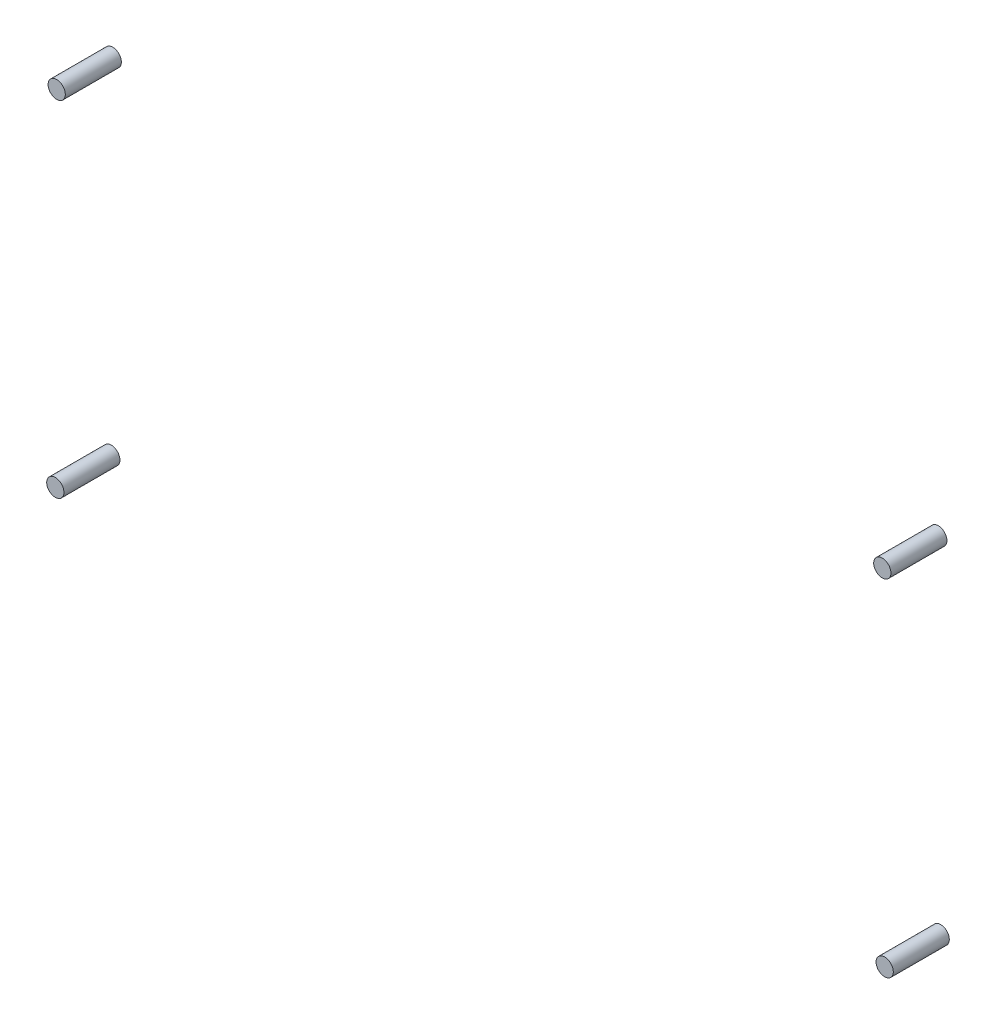
ISO-10303-21;
HEADER;
FILE_DESCRIPTION(('STEP AP214'),'2;1');
FILE_NAME('part.step','',(''),(''),'','','');
FILE_SCHEMA(('AUTOMOTIVE_DESIGN { 1 0 10303 214 1 1 1 1 }'));
ENDSEC;
DATA;
#1=APPLICATION_CONTEXT('core data for automotive mechanical design processes');
#2=APPLICATION_PROTOCOL_DEFINITION('international standard','automotive_design',2000,#1);
#3=PRODUCT_CONTEXT('',#1,'mechanical');
#4=PRODUCT('Part','Part','',(#3));
#5=PRODUCT_RELATED_PRODUCT_CATEGORY('part','',(#4));
#6=PRODUCT_DEFINITION_FORMATION('','',#4);
#7=PRODUCT_DEFINITION_CONTEXT('part definition',#1,'design');
#8=PRODUCT_DEFINITION('design','',#6,#7);
#9=PRODUCT_DEFINITION_SHAPE('','',#8);
#10=(LENGTH_UNIT() NAMED_UNIT(*) SI_UNIT(.MILLI.,.METRE.));
#11=(NAMED_UNIT(*) PLANE_ANGLE_UNIT() SI_UNIT($,.RADIAN.));
#12=(NAMED_UNIT(*) SI_UNIT($,.STERADIAN.) SOLID_ANGLE_UNIT());
#13=UNCERTAINTY_MEASURE_WITH_UNIT(LENGTH_MEASURE(1.E-05),#10,'distance_accuracy_value','');
#14=(GEOMETRIC_REPRESENTATION_CONTEXT(3) GLOBAL_UNCERTAINTY_ASSIGNED_CONTEXT((#13)) GLOBAL_UNIT_ASSIGNED_CONTEXT((#10,
#11,#12)) REPRESENTATION_CONTEXT('',''));
#15=CARTESIAN_POINT('',(0.,0.,0.));
#16=DIRECTION('',(0.,0.,1.));
#17=DIRECTION('',(1.,0.,0.));
#18=AXIS2_PLACEMENT_3D('',#15,#16,#17);
#19=CARTESIAN_POINT('',(46.693792227584,-228.9337388874,14.600050800102));
#20=DIRECTION('',(0.,0.,-1.));
#21=DIRECTION('',(-1.,0.,0.));
#22=AXIS2_PLACEMENT_3D('',#19,#20,#21);
#23=CYLINDRICAL_SURFACE('',#22,2.);
#24=CARTESIAN_POINT('',(46.693792227584,-228.9337388874,14.600050800102));
#25=DIRECTION('',(0.,0.,1.));
#26=DIRECTION('',(1.,0.,0.));
#27=AXIS2_PLACEMENT_3D('',#24,#25,#26);
#28=CIRCLE('',#27,2.);
#29=CARTESIAN_POINT('',(44.693792227584,-228.9337388874,14.600050800102));
#30=VERTEX_POINT('',#29);
#31=EDGE_CURVE('E11',#30,#30,#28,.T.);
#32=CARTESIAN_POINT('',(46.693792227584,-228.9337388874,1.600050800102));
#33=DIRECTION('',(0.,0.,1.));
#34=DIRECTION('',(1.,0.,0.));
#35=AXIS2_PLACEMENT_3D('',#32,#33,#34);
#36=CIRCLE('',#35,2.);
#37=CARTESIAN_POINT('',(44.693792227584,-228.9337388874,1.600050800102));
#38=VERTEX_POINT('',#37);
#39=EDGE_CURVE('E45',#38,#38,#36,.T.);
#40=CARTESIAN_POINT('',(44.693792227584,-228.9337388874,14.600050800102));
#41=CARTESIAN_POINT('',(44.693792227584,-228.9337388874,14.4646341334353));
#42=CARTESIAN_POINT('',(44.693792227584,-228.9337388874,14.3292174667687));
#43=CARTESIAN_POINT('',(44.693792227584,-228.9337388874,14.0583841334353));
#44=CARTESIAN_POINT('',(44.693792227584,-228.9337388874,13.9229674667687));
#45=CARTESIAN_POINT('',(44.693792227584,-228.9337388874,13.6521341334353));
#46=CARTESIAN_POINT('',(44.693792227584,-228.9337388874,13.5167174667687));
#47=CARTESIAN_POINT('',(44.693792227584,-228.9337388874,13.2458841334353));
#48=CARTESIAN_POINT('',(44.693792227584,-228.9337388874,13.1104674667687));
#49=CARTESIAN_POINT('',(44.693792227584,-228.9337388874,12.8396341334353));
#50=CARTESIAN_POINT('',(44.693792227584,-228.9337388874,12.7042174667687));
#51=CARTESIAN_POINT('',(44.693792227584,-228.9337388874,12.4333841334353));
#52=CARTESIAN_POINT('',(44.693792227584,-228.9337388874,12.2979674667687));
#53=CARTESIAN_POINT('',(44.693792227584,-228.9337388874,12.0271341334353));
#54=CARTESIAN_POINT('',(44.693792227584,-228.9337388874,11.8917174667687));
#55=CARTESIAN_POINT('',(44.693792227584,-228.9337388874,11.6208841334353));
#56=CARTESIAN_POINT('',(44.693792227584,-228.9337388874,11.4854674667687));
#57=CARTESIAN_POINT('',(44.693792227584,-228.9337388874,11.2146341334353));
#58=CARTESIAN_POINT('',(44.693792227584,-228.9337388874,11.0792174667687));
#59=CARTESIAN_POINT('',(44.693792227584,-228.9337388874,10.8083841334353));
#60=CARTESIAN_POINT('',(44.693792227584,-228.9337388874,10.6729674667687));
#61=CARTESIAN_POINT('',(44.693792227584,-228.9337388874,10.4021341334353));
#62=CARTESIAN_POINT('',(44.693792227584,-228.9337388874,10.2667174667687));
#63=CARTESIAN_POINT('',(44.693792227584,-228.9337388874,9.99588413343533));
#64=CARTESIAN_POINT('',(44.693792227584,-228.9337388874,9.86046746676867));
#65=CARTESIAN_POINT('',(44.693792227584,-228.9337388874,9.58963413343533));
#66=CARTESIAN_POINT('',(44.693792227584,-228.9337388874,9.45421746676867));
#67=CARTESIAN_POINT('',(44.693792227584,-228.9337388874,9.18338413343533));
#68=CARTESIAN_POINT('',(44.693792227584,-228.9337388874,9.04796746676867));
#69=CARTESIAN_POINT('',(44.693792227584,-228.9337388874,8.77713413343533));
#70=CARTESIAN_POINT('',(44.693792227584,-228.9337388874,8.64171746676867));
#71=CARTESIAN_POINT('',(44.693792227584,-228.9337388874,8.37088413343533));
#72=CARTESIAN_POINT('',(44.693792227584,-228.9337388874,8.23546746676867));
#73=CARTESIAN_POINT('',(44.693792227584,-228.9337388874,7.96463413343533));
#74=CARTESIAN_POINT('',(44.693792227584,-228.9337388874,7.82921746676867));
#75=CARTESIAN_POINT('',(44.693792227584,-228.9337388874,7.55838413343533));
#76=CARTESIAN_POINT('',(44.693792227584,-228.9337388874,7.42296746676867));
#77=CARTESIAN_POINT('',(44.693792227584,-228.9337388874,7.15213413343533));
#78=CARTESIAN_POINT('',(44.693792227584,-228.9337388874,7.01671746676867));
#79=CARTESIAN_POINT('',(44.693792227584,-228.9337388874,6.74588413343533));
#80=CARTESIAN_POINT('',(44.693792227584,-228.9337388874,6.61046746676867));
#81=CARTESIAN_POINT('',(44.693792227584,-228.9337388874,6.33963413343533));
#82=CARTESIAN_POINT('',(44.693792227584,-228.9337388874,6.20421746676867));
#83=CARTESIAN_POINT('',(44.693792227584,-228.9337388874,5.93338413343533));
#84=CARTESIAN_POINT('',(44.693792227584,-228.9337388874,5.79796746676867));
#85=CARTESIAN_POINT('',(44.693792227584,-228.9337388874,5.52713413343533));
#86=CARTESIAN_POINT('',(44.693792227584,-228.9337388874,5.39171746676867));
#87=CARTESIAN_POINT('',(44.693792227584,-228.9337388874,5.12088413343533));
#88=CARTESIAN_POINT('',(44.693792227584,-228.9337388874,4.98546746676867));
#89=CARTESIAN_POINT('',(44.693792227584,-228.9337388874,4.71463413343533));
#90=CARTESIAN_POINT('',(44.693792227584,-228.9337388874,4.57921746676867));
#91=CARTESIAN_POINT('',(44.693792227584,-228.9337388874,4.30838413343533));
#92=CARTESIAN_POINT('',(44.693792227584,-228.9337388874,4.17296746676867));
#93=CARTESIAN_POINT('',(44.693792227584,-228.9337388874,3.90213413343533));
#94=CARTESIAN_POINT('',(44.693792227584,-228.9337388874,3.76671746676867));
#95=CARTESIAN_POINT('',(44.693792227584,-228.9337388874,3.49588413343533));
#96=CARTESIAN_POINT('',(44.693792227584,-228.9337388874,3.36046746676867));
#97=CARTESIAN_POINT('',(44.693792227584,-228.9337388874,3.08963413343533));
#98=CARTESIAN_POINT('',(44.693792227584,-228.9337388874,2.95421746676867));
#99=CARTESIAN_POINT('',(44.693792227584,-228.9337388874,2.68338413343533));
#100=CARTESIAN_POINT('',(44.693792227584,-228.9337388874,2.54796746676867));
#101=CARTESIAN_POINT('',(44.693792227584,-228.9337388874,2.27713413343533));
#102=CARTESIAN_POINT('',(44.693792227584,-228.9337388874,2.14171746676867));
#103=CARTESIAN_POINT('',(44.693792227584,-228.9337388874,1.87088413343533));
#104=CARTESIAN_POINT('',(44.693792227584,-228.9337388874,1.73546746676867));
#105=CARTESIAN_POINT('',(44.693792227584,-228.9337388874,1.600050800102));
#106=B_SPLINE_CURVE_WITH_KNOTS('',3,(#40,#41,#42,#43,#44,#45,#46,#47,#48,#49,#50,#51,#52,#53,
#54,#55,#56,#57,#58,#59,#60,#61,#62,#63,#64,#65,#66,#67,#68,#69,#70,#71,#72,#73,#74,#75,#76,#77,
#78,#79,#80,#81,#82,#83,#84,#85,#86,#87,#88,#89,#90,#91,#92,#93,#94,#95,#96,#97,#98,#99,#100,
#101,#102,#103,#104,#105),.UNSPECIFIED.,.F.,.F.,(4,2,2,2,2,2,2,2,2,2,2,2,2,2,2,2,2,2,2,2,2,2,2,
2,2,2,2,2,2,2,2,2,4),(0.,0.40625,0.812500000000001,1.21875,1.625,2.03125,2.4375,2.84375,3.25,
3.65625,4.0625,4.46875,4.875,5.28125,5.6875,6.09375,6.5,6.90625,7.3125,7.71875,8.125,8.53125,
8.9375,9.34375,9.75,10.15625,10.5625,10.96875,11.375,11.78125,12.1875,12.59375,13.),.UNSPECIFIED.);
#107=EDGE_CURVE('BSEAM42',#30,#38,#106,.T.);
#108=ORIENTED_EDGE('',*,*,#31,.F.);
#109=ORIENTED_EDGE('',*,*,#39,.T.);
#110=ORIENTED_EDGE('',*,*,#107,.T.);
#111=ORIENTED_EDGE('',*,*,#107,.F.);
#112=EDGE_LOOP('',(#108,#110,#109,#111));
#113=FACE_BOUND('',#112,.T.);
#114=ADVANCED_FACE('F42',(#113),#23,.T.);
#115=CARTESIAN_POINT('',(46.693792227584,-228.9337388874,14.600050800102));
#116=DIRECTION('',(0.,0.,1.));
#117=DIRECTION('',(1.,0.,0.));
#118=AXIS2_PLACEMENT_3D('',#115,#116,#117);
#119=PLANE('',#118);
#120=ORIENTED_EDGE('',*,*,#31,.T.);
#121=EDGE_LOOP('',(#120));
#122=FACE_BOUND('',#121,.T.);
#123=ADVANCED_FACE('F57',(#122),#119,.T.);
#124=CARTESIAN_POINT('',(46.693792227584,-228.9337388874,1.600050800102));
#125=DIRECTION('',(0.,0.,1.));
#126=DIRECTION('',(1.,0.,0.));
#127=AXIS2_PLACEMENT_3D('',#124,#125,#126);
#128=PLANE('',#127);
#129=ORIENTED_EDGE('',*,*,#39,.F.);
#130=EDGE_LOOP('',(#129));
#131=FACE_BOUND('',#130,.T.);
#132=ADVANCED_FACE('F55',(#131),#128,.F.);
#133=CLOSED_SHELL('',(#114,#123,#132));
#134=MANIFOLD_SOLID_BREP('B2',#133);
#135=CARTESIAN_POINT('',(239.15653035306,-229.0607391414,14.600050800102));
#136=DIRECTION('',(0.,0.,-1.));
#137=DIRECTION('',(-1.,0.,0.));
#138=AXIS2_PLACEMENT_3D('',#135,#136,#137);
#139=CYLINDRICAL_SURFACE('',#138,2.);
#140=CARTESIAN_POINT('',(239.15653035306,-229.0607391414,14.600050800102));
#141=DIRECTION('',(0.,0.,1.));
#142=DIRECTION('',(1.,0.,0.));
#143=AXIS2_PLACEMENT_3D('',#140,#141,#142);
#144=CIRCLE('',#143,2.);
#145=CARTESIAN_POINT('',(237.15653035306,-229.0607391414,14.600050800102));
#146=VERTEX_POINT('',#145);
#147=EDGE_CURVE('E41',#146,#146,#144,.T.);
#148=CARTESIAN_POINT('',(239.15653035306,-229.0607391414,1.600050800102));
#149=DIRECTION('',(0.,0.,1.));
#150=DIRECTION('',(1.,0.,0.));
#151=AXIS2_PLACEMENT_3D('',#148,#149,#150);
#152=CIRCLE('',#151,2.);
#153=CARTESIAN_POINT('',(237.15653035306,-229.0607391414,1.600050800102));
#154=VERTEX_POINT('',#153);
#155=EDGE_CURVE('E94',#154,#154,#152,.T.);
#156=CARTESIAN_POINT('',(237.15653035306,-229.0607391414,14.600050800102));
#157=CARTESIAN_POINT('',(237.15653035306,-229.0607391414,14.4646341334353));
#158=CARTESIAN_POINT('',(237.15653035306,-229.0607391414,14.3292174667687));
#159=CARTESIAN_POINT('',(237.15653035306,-229.0607391414,14.0583841334353));
#160=CARTESIAN_POINT('',(237.15653035306,-229.0607391414,13.9229674667687));
#161=CARTESIAN_POINT('',(237.15653035306,-229.0607391414,13.6521341334353));
#162=CARTESIAN_POINT('',(237.15653035306,-229.0607391414,13.5167174667687));
#163=CARTESIAN_POINT('',(237.15653035306,-229.0607391414,13.2458841334353));
#164=CARTESIAN_POINT('',(237.15653035306,-229.0607391414,13.1104674667687));
#165=CARTESIAN_POINT('',(237.15653035306,-229.0607391414,12.8396341334353));
#166=CARTESIAN_POINT('',(237.15653035306,-229.0607391414,12.7042174667687));
#167=CARTESIAN_POINT('',(237.15653035306,-229.0607391414,12.4333841334353));
#168=CARTESIAN_POINT('',(237.15653035306,-229.0607391414,12.2979674667687));
#169=CARTESIAN_POINT('',(237.15653035306,-229.0607391414,12.0271341334353));
#170=CARTESIAN_POINT('',(237.15653035306,-229.0607391414,11.8917174667687));
#171=CARTESIAN_POINT('',(237.15653035306,-229.0607391414,11.6208841334353));
#172=CARTESIAN_POINT('',(237.15653035306,-229.0607391414,11.4854674667687));
#173=CARTESIAN_POINT('',(237.15653035306,-229.0607391414,11.2146341334353));
#174=CARTESIAN_POINT('',(237.15653035306,-229.0607391414,11.0792174667687));
#175=CARTESIAN_POINT('',(237.15653035306,-229.0607391414,10.8083841334353));
#176=CARTESIAN_POINT('',(237.15653035306,-229.0607391414,10.6729674667687));
#177=CARTESIAN_POINT('',(237.15653035306,-229.0607391414,10.4021341334353));
#178=CARTESIAN_POINT('',(237.15653035306,-229.0607391414,10.2667174667687));
#179=CARTESIAN_POINT('',(237.15653035306,-229.0607391414,9.99588413343533));
#180=CARTESIAN_POINT('',(237.15653035306,-229.0607391414,9.86046746676867));
#181=CARTESIAN_POINT('',(237.15653035306,-229.0607391414,9.58963413343533));
#182=CARTESIAN_POINT('',(237.15653035306,-229.0607391414,9.45421746676867));
#183=CARTESIAN_POINT('',(237.15653035306,-229.0607391414,9.18338413343533));
#184=CARTESIAN_POINT('',(237.15653035306,-229.0607391414,9.04796746676867));
#185=CARTESIAN_POINT('',(237.15653035306,-229.0607391414,8.77713413343533));
#186=CARTESIAN_POINT('',(237.15653035306,-229.0607391414,8.64171746676867));
#187=CARTESIAN_POINT('',(237.15653035306,-229.0607391414,8.37088413343533));
#188=CARTESIAN_POINT('',(237.15653035306,-229.0607391414,8.23546746676867));
#189=CARTESIAN_POINT('',(237.15653035306,-229.0607391414,7.96463413343533));
#190=CARTESIAN_POINT('',(237.15653035306,-229.0607391414,7.82921746676867));
#191=CARTESIAN_POINT('',(237.15653035306,-229.0607391414,7.55838413343533));
#192=CARTESIAN_POINT('',(237.15653035306,-229.0607391414,7.42296746676867));
#193=CARTESIAN_POINT('',(237.15653035306,-229.0607391414,7.15213413343533));
#194=CARTESIAN_POINT('',(237.15653035306,-229.0607391414,7.01671746676867));
#195=CARTESIAN_POINT('',(237.15653035306,-229.0607391414,6.74588413343533));
#196=CARTESIAN_POINT('',(237.15653035306,-229.0607391414,6.61046746676867));
#197=CARTESIAN_POINT('',(237.15653035306,-229.0607391414,6.33963413343533));
#198=CARTESIAN_POINT('',(237.15653035306,-229.0607391414,6.20421746676867));
#199=CARTESIAN_POINT('',(237.15653035306,-229.0607391414,5.93338413343533));
#200=CARTESIAN_POINT('',(237.15653035306,-229.0607391414,5.79796746676867));
#201=CARTESIAN_POINT('',(237.15653035306,-229.0607391414,5.52713413343533));
#202=CARTESIAN_POINT('',(237.15653035306,-229.0607391414,5.39171746676867));
#203=CARTESIAN_POINT('',(237.15653035306,-229.0607391414,5.12088413343533));
#204=CARTESIAN_POINT('',(237.15653035306,-229.0607391414,4.98546746676867));
#205=CARTESIAN_POINT('',(237.15653035306,-229.0607391414,4.71463413343533));
#206=CARTESIAN_POINT('',(237.15653035306,-229.0607391414,4.57921746676867));
#207=CARTESIAN_POINT('',(237.15653035306,-229.0607391414,4.30838413343533));
#208=CARTESIAN_POINT('',(237.15653035306,-229.0607391414,4.17296746676867));
#209=CARTESIAN_POINT('',(237.15653035306,-229.0607391414,3.90213413343533));
#210=CARTESIAN_POINT('',(237.15653035306,-229.0607391414,3.76671746676867));
#211=CARTESIAN_POINT('',(237.15653035306,-229.0607391414,3.49588413343533));
#212=CARTESIAN_POINT('',(237.15653035306,-229.0607391414,3.36046746676867));
#213=CARTESIAN_POINT('',(237.15653035306,-229.0607391414,3.08963413343533));
#214=CARTESIAN_POINT('',(237.15653035306,-229.0607391414,2.95421746676867));
#215=CARTESIAN_POINT('',(237.15653035306,-229.0607391414,2.68338413343533));
#216=CARTESIAN_POINT('',(237.15653035306,-229.0607391414,2.54796746676867));
#217=CARTESIAN_POINT('',(237.15653035306,-229.0607391414,2.27713413343533));
#218=CARTESIAN_POINT('',(237.15653035306,-229.0607391414,2.14171746676867));
#219=CARTESIAN_POINT('',(237.15653035306,-229.0607391414,1.87088413343533));
#220=CARTESIAN_POINT('',(237.15653035306,-229.0607391414,1.73546746676867));
#221=CARTESIAN_POINT('',(237.15653035306,-229.0607391414,1.600050800102));
#222=B_SPLINE_CURVE_WITH_KNOTS('',3,(#156,#157,#158,#159,#160,#161,#162,#163,#164,#165,#166,
#167,#168,#169,#170,#171,#172,#173,#174,#175,#176,#177,#178,#179,#180,#181,#182,#183,#184,#185,
#186,#187,#188,#189,#190,#191,#192,#193,#194,#195,#196,#197,#198,#199,#200,#201,#202,#203,#204,
#205,#206,#207,#208,#209,#210,#211,#212,#213,#214,#215,#216,#217,#218,#219,#220,#221),
.UNSPECIFIED.,.F.,.F.,(4,2,2,2,2,2,2,2,2,2,2,2,2,2,2,2,2,2,2,2,2,2,2,2,2,2,2,2,2,2,2,2,4),(0.,
0.40625,0.812500000000001,1.21875,1.625,2.03125,2.4375,2.84375,3.25,3.65625,4.0625,4.46875,
4.875,5.28125,5.6875,6.09375,6.5,6.90625,7.3125,7.71875,8.125,8.53125,8.9375,9.34375,9.75,
10.15625,10.5625,10.96875,11.375,11.78125,12.1875,12.59375,13.),.UNSPECIFIED.);
#223=EDGE_CURVE('BSEAM91',#146,#154,#222,.T.);
#224=ORIENTED_EDGE('',*,*,#147,.F.);
#225=ORIENTED_EDGE('',*,*,#155,.T.);
#226=ORIENTED_EDGE('',*,*,#223,.T.);
#227=ORIENTED_EDGE('',*,*,#223,.F.);
#228=EDGE_LOOP('',(#224,#226,#225,#227));
#229=FACE_BOUND('',#228,.T.);
#230=ADVANCED_FACE('F91',(#229),#139,.T.);
#231=CARTESIAN_POINT('',(239.15653035306,-229.0607391414,14.600050800102));
#232=DIRECTION('',(0.,0.,1.));
#233=DIRECTION('',(1.,0.,0.));
#234=AXIS2_PLACEMENT_3D('',#231,#232,#233);
#235=PLANE('',#234);
#236=ORIENTED_EDGE('',*,*,#147,.T.);
#237=EDGE_LOOP('',(#236));
#238=FACE_BOUND('',#237,.T.);
#239=ADVANCED_FACE('F106',(#238),#235,.T.);
#240=CARTESIAN_POINT('',(239.15653035306,-229.0607391414,1.600050800102));
#241=DIRECTION('',(0.,0.,1.));
#242=DIRECTION('',(1.,0.,0.));
#243=AXIS2_PLACEMENT_3D('',#240,#241,#242);
#244=PLANE('',#243);
#245=ORIENTED_EDGE('',*,*,#155,.F.);
#246=EDGE_LOOP('',(#245));
#247=FACE_BOUND('',#246,.T.);
#248=ADVANCED_FACE('F104',(#247),#244,.F.);
#249=CLOSED_SHELL('',(#230,#239,#248));
#250=MANIFOLD_SOLID_BREP('B6',#249);
#251=CARTESIAN_POINT('',(238.60347218694,-149.1775793751,14.600050800102));
#252=DIRECTION('',(0.,0.,-1.));
#253=DIRECTION('',(-1.,0.,0.));
#254=AXIS2_PLACEMENT_3D('',#251,#252,#253);
#255=CYLINDRICAL_SURFACE('',#254,2.);
#256=CARTESIAN_POINT('',(238.60347218694,-149.1775793751,14.600050800102));
#257=DIRECTION('',(0.,0.,1.));
#258=DIRECTION('',(1.,0.,0.));
#259=AXIS2_PLACEMENT_3D('',#256,#257,#258);
#260=CIRCLE('',#259,2.);
#261=CARTESIAN_POINT('',(236.60347218694,-149.1775793751,14.600050800102));
#262=VERTEX_POINT('',#261);
#263=EDGE_CURVE('E90',#262,#262,#260,.T.);
#264=CARTESIAN_POINT('',(238.60347218694,-149.1775793751,1.600050800102));
#265=DIRECTION('',(0.,0.,1.));
#266=DIRECTION('',(1.,0.,0.));
#267=AXIS2_PLACEMENT_3D('',#264,#265,#266);
#268=CIRCLE('',#267,2.);
#269=CARTESIAN_POINT('',(236.60347218694,-149.1775793751,1.600050800102));
#270=VERTEX_POINT('',#269);
#271=EDGE_CURVE('E142',#270,#270,#268,.T.);
#272=CARTESIAN_POINT('',(236.60347218694,-149.1775793751,14.600050800102));
#273=CARTESIAN_POINT('',(236.60347218694,-149.1775793751,14.4646341334353));
#274=CARTESIAN_POINT('',(236.60347218694,-149.1775793751,14.3292174667687));
#275=CARTESIAN_POINT('',(236.60347218694,-149.1775793751,14.0583841334353));
#276=CARTESIAN_POINT('',(236.60347218694,-149.1775793751,13.9229674667687));
#277=CARTESIAN_POINT('',(236.60347218694,-149.1775793751,13.6521341334353));
#278=CARTESIAN_POINT('',(236.60347218694,-149.1775793751,13.5167174667687));
#279=CARTESIAN_POINT('',(236.60347218694,-149.1775793751,13.2458841334353));
#280=CARTESIAN_POINT('',(236.60347218694,-149.1775793751,13.1104674667687));
#281=CARTESIAN_POINT('',(236.60347218694,-149.1775793751,12.8396341334353));
#282=CARTESIAN_POINT('',(236.60347218694,-149.1775793751,12.7042174667687));
#283=CARTESIAN_POINT('',(236.60347218694,-149.1775793751,12.4333841334353));
#284=CARTESIAN_POINT('',(236.60347218694,-149.1775793751,12.2979674667687));
#285=CARTESIAN_POINT('',(236.60347218694,-149.1775793751,12.0271341334353));
#286=CARTESIAN_POINT('',(236.60347218694,-149.1775793751,11.8917174667687));
#287=CARTESIAN_POINT('',(236.60347218694,-149.1775793751,11.6208841334353));
#288=CARTESIAN_POINT('',(236.60347218694,-149.1775793751,11.4854674667687));
#289=CARTESIAN_POINT('',(236.60347218694,-149.1775793751,11.2146341334353));
#290=CARTESIAN_POINT('',(236.60347218694,-149.1775793751,11.0792174667687));
#291=CARTESIAN_POINT('',(236.60347218694,-149.1775793751,10.8083841334353));
#292=CARTESIAN_POINT('',(236.60347218694,-149.1775793751,10.6729674667687));
#293=CARTESIAN_POINT('',(236.60347218694,-149.1775793751,10.4021341334353));
#294=CARTESIAN_POINT('',(236.60347218694,-149.1775793751,10.2667174667687));
#295=CARTESIAN_POINT('',(236.60347218694,-149.1775793751,9.99588413343533));
#296=CARTESIAN_POINT('',(236.60347218694,-149.1775793751,9.86046746676867));
#297=CARTESIAN_POINT('',(236.60347218694,-149.1775793751,9.58963413343533));
#298=CARTESIAN_POINT('',(236.60347218694,-149.1775793751,9.45421746676867));
#299=CARTESIAN_POINT('',(236.60347218694,-149.1775793751,9.18338413343533));
#300=CARTESIAN_POINT('',(236.60347218694,-149.1775793751,9.04796746676867));
#301=CARTESIAN_POINT('',(236.60347218694,-149.1775793751,8.77713413343533));
#302=CARTESIAN_POINT('',(236.60347218694,-149.1775793751,8.64171746676867));
#303=CARTESIAN_POINT('',(236.60347218694,-149.1775793751,8.37088413343533));
#304=CARTESIAN_POINT('',(236.60347218694,-149.1775793751,8.23546746676867));
#305=CARTESIAN_POINT('',(236.60347218694,-149.1775793751,7.96463413343533));
#306=CARTESIAN_POINT('',(236.60347218694,-149.1775793751,7.82921746676867));
#307=CARTESIAN_POINT('',(236.60347218694,-149.1775793751,7.55838413343533));
#308=CARTESIAN_POINT('',(236.60347218694,-149.1775793751,7.42296746676867));
#309=CARTESIAN_POINT('',(236.60347218694,-149.1775793751,7.15213413343533));
#310=CARTESIAN_POINT('',(236.60347218694,-149.1775793751,7.01671746676867));
#311=CARTESIAN_POINT('',(236.60347218694,-149.1775793751,6.74588413343533));
#312=CARTESIAN_POINT('',(236.60347218694,-149.1775793751,6.61046746676867));
#313=CARTESIAN_POINT('',(236.60347218694,-149.1775793751,6.33963413343533));
#314=CARTESIAN_POINT('',(236.60347218694,-149.1775793751,6.20421746676867));
#315=CARTESIAN_POINT('',(236.60347218694,-149.1775793751,5.93338413343533));
#316=CARTESIAN_POINT('',(236.60347218694,-149.1775793751,5.79796746676867));
#317=CARTESIAN_POINT('',(236.60347218694,-149.1775793751,5.52713413343533));
#318=CARTESIAN_POINT('',(236.60347218694,-149.1775793751,5.39171746676867));
#319=CARTESIAN_POINT('',(236.60347218694,-149.1775793751,5.12088413343533));
#320=CARTESIAN_POINT('',(236.60347218694,-149.1775793751,4.98546746676867));
#321=CARTESIAN_POINT('',(236.60347218694,-149.1775793751,4.71463413343533));
#322=CARTESIAN_POINT('',(236.60347218694,-149.1775793751,4.57921746676867));
#323=CARTESIAN_POINT('',(236.60347218694,-149.1775793751,4.30838413343533));
#324=CARTESIAN_POINT('',(236.60347218694,-149.1775793751,4.17296746676867));
#325=CARTESIAN_POINT('',(236.60347218694,-149.1775793751,3.90213413343533));
#326=CARTESIAN_POINT('',(236.60347218694,-149.1775793751,3.76671746676867));
#327=CARTESIAN_POINT('',(236.60347218694,-149.1775793751,3.49588413343533));
#328=CARTESIAN_POINT('',(236.60347218694,-149.1775793751,3.36046746676867));
#329=CARTESIAN_POINT('',(236.60347218694,-149.1775793751,3.08963413343533));
#330=CARTESIAN_POINT('',(236.60347218694,-149.1775793751,2.95421746676867));
#331=CARTESIAN_POINT('',(236.60347218694,-149.1775793751,2.68338413343533));
#332=CARTESIAN_POINT('',(236.60347218694,-149.1775793751,2.54796746676867));
#333=CARTESIAN_POINT('',(236.60347218694,-149.1775793751,2.27713413343533));
#334=CARTESIAN_POINT('',(236.60347218694,-149.1775793751,2.14171746676867));
#335=CARTESIAN_POINT('',(236.60347218694,-149.1775793751,1.87088413343533));
#336=CARTESIAN_POINT('',(236.60347218694,-149.1775793751,1.73546746676867));
#337=CARTESIAN_POINT('',(236.60347218694,-149.1775793751,1.600050800102));
#338=B_SPLINE_CURVE_WITH_KNOTS('',3,(#272,#273,#274,#275,#276,#277,#278,#279,#280,#281,#282,
#283,#284,#285,#286,#287,#288,#289,#290,#291,#292,#293,#294,#295,#296,#297,#298,#299,#300,#301,
#302,#303,#304,#305,#306,#307,#308,#309,#310,#311,#312,#313,#314,#315,#316,#317,#318,#319,#320,
#321,#322,#323,#324,#325,#326,#327,#328,#329,#330,#331,#332,#333,#334,#335,#336,#337),
.UNSPECIFIED.,.F.,.F.,(4,2,2,2,2,2,2,2,2,2,2,2,2,2,2,2,2,2,2,2,2,2,2,2,2,2,2,2,2,2,2,2,4),(0.,
0.40625,0.812500000000001,1.21875,1.625,2.03125,2.4375,2.84375,3.25,3.65625,4.0625,4.46875,
4.875,5.28125,5.6875,6.09375,6.5,6.90625,7.3125,7.71875,8.125,8.53125,8.9375,9.34375,9.75,
10.15625,10.5625,10.96875,11.375,11.78125,12.1875,12.59375,13.),.UNSPECIFIED.);
#339=EDGE_CURVE('BSEAM139',#262,#270,#338,.T.);
#340=ORIENTED_EDGE('',*,*,#263,.F.);
#341=ORIENTED_EDGE('',*,*,#271,.T.);
#342=ORIENTED_EDGE('',*,*,#339,.T.);
#343=ORIENTED_EDGE('',*,*,#339,.F.);
#344=EDGE_LOOP('',(#340,#342,#341,#343));
#345=FACE_BOUND('',#344,.T.);
#346=ADVANCED_FACE('F139',(#345),#255,.T.);
#347=CARTESIAN_POINT('',(238.60347218694,-149.1775793751,14.600050800102));
#348=DIRECTION('',(0.,0.,1.));
#349=DIRECTION('',(1.,0.,0.));
#350=AXIS2_PLACEMENT_3D('',#347,#348,#349);
#351=PLANE('',#350);
#352=ORIENTED_EDGE('',*,*,#263,.T.);
#353=EDGE_LOOP('',(#352));
#354=FACE_BOUND('',#353,.T.);
#355=ADVANCED_FACE('F154',(#354),#351,.T.);
#356=CARTESIAN_POINT('',(238.60347218694,-149.1775793751,1.600050800102));
#357=DIRECTION('',(0.,0.,1.));
#358=DIRECTION('',(1.,0.,0.));
#359=AXIS2_PLACEMENT_3D('',#356,#357,#358);
#360=PLANE('',#359);
#361=ORIENTED_EDGE('',*,*,#271,.F.);
#362=EDGE_LOOP('',(#361));
#363=FACE_BOUND('',#362,.T.);
#364=ADVANCED_FACE('F152',(#363),#360,.F.);
#365=CLOSED_SHELL('',(#346,#355,#364));
#366=MANIFOLD_SOLID_BREP('B36',#365);
#367=CARTESIAN_POINT('',(47.017442214884,-148.7965786131,14.600050800102));
#368=DIRECTION('',(0.,0.,-1.));
#369=DIRECTION('',(-1.,0.,0.));
#370=AXIS2_PLACEMENT_3D('',#367,#368,#369);
#371=CYLINDRICAL_SURFACE('',#370,2.);
#372=CARTESIAN_POINT('',(47.017442214884,-148.7965786131,14.600050800102));
#373=DIRECTION('',(0.,0.,1.));
#374=DIRECTION('',(1.,0.,0.));
#375=AXIS2_PLACEMENT_3D('',#372,#373,#374);
#376=CIRCLE('',#375,2.);
#377=CARTESIAN_POINT('',(45.017442214884,-148.7965786131,14.600050800102));
#378=VERTEX_POINT('',#377);
#379=EDGE_CURVE('E138',#378,#378,#376,.T.);
#380=CARTESIAN_POINT('',(47.017442214884,-148.7965786131,1.600050800102));
#381=DIRECTION('',(0.,0.,1.));
#382=DIRECTION('',(1.,0.,0.));
#383=AXIS2_PLACEMENT_3D('',#380,#381,#382);
#384=CIRCLE('',#383,2.);
#385=CARTESIAN_POINT('',(45.017442214884,-148.7965786131,1.600050800102));
#386=VERTEX_POINT('',#385);
#387=EDGE_CURVE('E183',#386,#386,#384,.T.);
#388=CARTESIAN_POINT('',(45.017442214884,-148.7965786131,14.600050800102));
#389=CARTESIAN_POINT('',(45.017442214884,-148.7965786131,14.4646341334353));
#390=CARTESIAN_POINT('',(45.017442214884,-148.7965786131,14.3292174667687));
#391=CARTESIAN_POINT('',(45.017442214884,-148.7965786131,14.0583841334353));
#392=CARTESIAN_POINT('',(45.017442214884,-148.7965786131,13.9229674667687));
#393=CARTESIAN_POINT('',(45.017442214884,-148.7965786131,13.6521341334353));
#394=CARTESIAN_POINT('',(45.017442214884,-148.7965786131,13.5167174667687));
#395=CARTESIAN_POINT('',(45.017442214884,-148.7965786131,13.2458841334353));
#396=CARTESIAN_POINT('',(45.017442214884,-148.7965786131,13.1104674667687));
#397=CARTESIAN_POINT('',(45.017442214884,-148.7965786131,12.8396341334353));
#398=CARTESIAN_POINT('',(45.017442214884,-148.7965786131,12.7042174667687));
#399=CARTESIAN_POINT('',(45.017442214884,-148.7965786131,12.4333841334353));
#400=CARTESIAN_POINT('',(45.017442214884,-148.7965786131,12.2979674667687));
#401=CARTESIAN_POINT('',(45.017442214884,-148.7965786131,12.0271341334353));
#402=CARTESIAN_POINT('',(45.017442214884,-148.7965786131,11.8917174667687));
#403=CARTESIAN_POINT('',(45.017442214884,-148.7965786131,11.6208841334353));
#404=CARTESIAN_POINT('',(45.017442214884,-148.7965786131,11.4854674667687));
#405=CARTESIAN_POINT('',(45.017442214884,-148.7965786131,11.2146341334353));
#406=CARTESIAN_POINT('',(45.017442214884,-148.7965786131,11.0792174667687));
#407=CARTESIAN_POINT('',(45.017442214884,-148.7965786131,10.8083841334353));
#408=CARTESIAN_POINT('',(45.017442214884,-148.7965786131,10.6729674667687));
#409=CARTESIAN_POINT('',(45.017442214884,-148.7965786131,10.4021341334353));
#410=CARTESIAN_POINT('',(45.017442214884,-148.7965786131,10.2667174667687));
#411=CARTESIAN_POINT('',(45.017442214884,-148.7965786131,9.99588413343533));
#412=CARTESIAN_POINT('',(45.017442214884,-148.7965786131,9.86046746676867));
#413=CARTESIAN_POINT('',(45.017442214884,-148.7965786131,9.58963413343533));
#414=CARTESIAN_POINT('',(45.017442214884,-148.7965786131,9.45421746676867));
#415=CARTESIAN_POINT('',(45.017442214884,-148.7965786131,9.18338413343533));
#416=CARTESIAN_POINT('',(45.017442214884,-148.7965786131,9.04796746676867));
#417=CARTESIAN_POINT('',(45.017442214884,-148.7965786131,8.77713413343533));
#418=CARTESIAN_POINT('',(45.017442214884,-148.7965786131,8.64171746676867));
#419=CARTESIAN_POINT('',(45.017442214884,-148.7965786131,8.37088413343533));
#420=CARTESIAN_POINT('',(45.017442214884,-148.7965786131,8.23546746676867));
#421=CARTESIAN_POINT('',(45.017442214884,-148.7965786131,7.96463413343533));
#422=CARTESIAN_POINT('',(45.017442214884,-148.7965786131,7.82921746676867));
#423=CARTESIAN_POINT('',(45.017442214884,-148.7965786131,7.55838413343533));
#424=CARTESIAN_POINT('',(45.017442214884,-148.7965786131,7.42296746676867));
#425=CARTESIAN_POINT('',(45.017442214884,-148.7965786131,7.15213413343533));
#426=CARTESIAN_POINT('',(45.017442214884,-148.7965786131,7.01671746676867));
#427=CARTESIAN_POINT('',(45.017442214884,-148.7965786131,6.74588413343533));
#428=CARTESIAN_POINT('',(45.017442214884,-148.7965786131,6.61046746676867));
#429=CARTESIAN_POINT('',(45.017442214884,-148.7965786131,6.33963413343533));
#430=CARTESIAN_POINT('',(45.017442214884,-148.7965786131,6.20421746676867));
#431=CARTESIAN_POINT('',(45.017442214884,-148.7965786131,5.93338413343533));
#432=CARTESIAN_POINT('',(45.017442214884,-148.7965786131,5.79796746676867));
#433=CARTESIAN_POINT('',(45.017442214884,-148.7965786131,5.52713413343533));
#434=CARTESIAN_POINT('',(45.017442214884,-148.7965786131,5.39171746676867));
#435=CARTESIAN_POINT('',(45.017442214884,-148.7965786131,5.12088413343533));
#436=CARTESIAN_POINT('',(45.017442214884,-148.7965786131,4.98546746676867));
#437=CARTESIAN_POINT('',(45.017442214884,-148.7965786131,4.71463413343533));
#438=CARTESIAN_POINT('',(45.017442214884,-148.7965786131,4.57921746676867));
#439=CARTESIAN_POINT('',(45.017442214884,-148.7965786131,4.30838413343533));
#440=CARTESIAN_POINT('',(45.017442214884,-148.7965786131,4.17296746676867));
#441=CARTESIAN_POINT('',(45.017442214884,-148.7965786131,3.90213413343533));
#442=CARTESIAN_POINT('',(45.017442214884,-148.7965786131,3.76671746676867));
#443=CARTESIAN_POINT('',(45.017442214884,-148.7965786131,3.49588413343533));
#444=CARTESIAN_POINT('',(45.017442214884,-148.7965786131,3.36046746676867));
#445=CARTESIAN_POINT('',(45.017442214884,-148.7965786131,3.08963413343533));
#446=CARTESIAN_POINT('',(45.017442214884,-148.7965786131,2.95421746676867));
#447=CARTESIAN_POINT('',(45.017442214884,-148.7965786131,2.68338413343533));
#448=CARTESIAN_POINT('',(45.017442214884,-148.7965786131,2.54796746676867));
#449=CARTESIAN_POINT('',(45.017442214884,-148.7965786131,2.27713413343533));
#450=CARTESIAN_POINT('',(45.017442214884,-148.7965786131,2.14171746676867));
#451=CARTESIAN_POINT('',(45.017442214884,-148.7965786131,1.87088413343533));
#452=CARTESIAN_POINT('',(45.017442214884,-148.7965786131,1.73546746676867));
#453=CARTESIAN_POINT('',(45.017442214884,-148.7965786131,1.600050800102));
#454=B_SPLINE_CURVE_WITH_KNOTS('',3,(#388,#389,#390,#391,#392,#393,#394,#395,#396,#397,#398,
#399,#400,#401,#402,#403,#404,#405,#406,#407,#408,#409,#410,#411,#412,#413,#414,#415,#416,#417,
#418,#419,#420,#421,#422,#423,#424,#425,#426,#427,#428,#429,#430,#431,#432,#433,#434,#435,#436,
#437,#438,#439,#440,#441,#442,#443,#444,#445,#446,#447,#448,#449,#450,#451,#452,#453),
.UNSPECIFIED.,.F.,.F.,(4,2,2,2,2,2,2,2,2,2,2,2,2,2,2,2,2,2,2,2,2,2,2,2,2,2,2,2,2,2,2,2,4),(0.,
0.40625,0.812500000000001,1.21875,1.625,2.03125,2.4375,2.84375,3.25,3.65625,4.0625,4.46875,
4.875,5.28125,5.6875,6.09375,6.5,6.90625,7.3125,7.71875,8.125,8.53125,8.9375,9.34375,9.75,
10.15625,10.5625,10.96875,11.375,11.78125,12.1875,12.59375,13.),.UNSPECIFIED.);
#455=EDGE_CURVE('BSEAM180',#378,#386,#454,.T.);
#456=ORIENTED_EDGE('',*,*,#379,.F.);
#457=ORIENTED_EDGE('',*,*,#387,.T.);
#458=ORIENTED_EDGE('',*,*,#455,.T.);
#459=ORIENTED_EDGE('',*,*,#455,.F.);
#460=EDGE_LOOP('',(#456,#458,#457,#459));
#461=FACE_BOUND('',#460,.T.);
#462=ADVANCED_FACE('F180',(#461),#371,.T.);
#463=CARTESIAN_POINT('',(47.017442214884,-148.7965786131,14.600050800102));
#464=DIRECTION('',(0.,0.,1.));
#465=DIRECTION('',(1.,0.,0.));
#466=AXIS2_PLACEMENT_3D('',#463,#464,#465);
#467=PLANE('',#466);
#468=ORIENTED_EDGE('',*,*,#379,.T.);
#469=EDGE_LOOP('',(#468));
#470=FACE_BOUND('',#469,.T.);
#471=ADVANCED_FACE('F195',(#470),#467,.T.);
#472=CARTESIAN_POINT('',(47.017442214884,-148.7965786131,1.600050800102));
#473=DIRECTION('',(0.,0.,1.));
#474=DIRECTION('',(1.,0.,0.));
#475=AXIS2_PLACEMENT_3D('',#472,#473,#474);
#476=PLANE('',#475);
#477=ORIENTED_EDGE('',*,*,#387,.F.);
#478=EDGE_LOOP('',(#477));
#479=FACE_BOUND('',#478,.T.);
#480=ADVANCED_FACE('F193',(#479),#476,.F.);
#481=CLOSED_SHELL('',(#462,#471,#480));
#482=MANIFOLD_SOLID_BREP('B85',#481);
#483=ADVANCED_BREP_SHAPE_REPRESENTATION('',(#18,#134,#250,#366,#482),#14);
#484=SHAPE_DEFINITION_REPRESENTATION(#9,#483);
ENDSEC;
END-ISO-10303-21;
